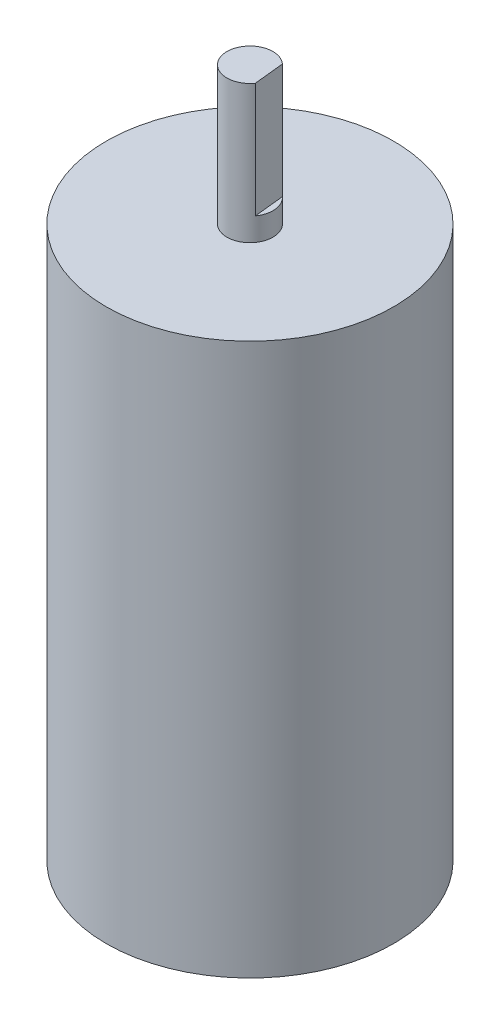
ISO-10303-21;
HEADER;
FILE_DESCRIPTION(('STEP AP214'),'2;1');
FILE_NAME('part.step','',(''),(''),'','','');
FILE_SCHEMA(('AUTOMOTIVE_DESIGN { 1 0 10303 214 1 1 1 1 }'));
ENDSEC;
DATA;
#1=APPLICATION_CONTEXT('core data for automotive mechanical design processes');
#2=APPLICATION_PROTOCOL_DEFINITION('international standard','automotive_design',2000,#1);
#3=PRODUCT_CONTEXT('',#1,'mechanical');
#4=PRODUCT('Part','Part','',(#3));
#5=PRODUCT_RELATED_PRODUCT_CATEGORY('part','',(#4));
#6=PRODUCT_DEFINITION_FORMATION('','',#4);
#7=PRODUCT_DEFINITION_CONTEXT('part definition',#1,'design');
#8=PRODUCT_DEFINITION('design','',#6,#7);
#9=PRODUCT_DEFINITION_SHAPE('','',#8);
#10=(LENGTH_UNIT() NAMED_UNIT(*) SI_UNIT(.MILLI.,.METRE.));
#11=(NAMED_UNIT(*) PLANE_ANGLE_UNIT() SI_UNIT($,.RADIAN.));
#12=(NAMED_UNIT(*) SI_UNIT($,.STERADIAN.) SOLID_ANGLE_UNIT());
#13=UNCERTAINTY_MEASURE_WITH_UNIT(LENGTH_MEASURE(1.E-05),#10,'distance_accuracy_value','');
#14=(GEOMETRIC_REPRESENTATION_CONTEXT(3) GLOBAL_UNCERTAINTY_ASSIGNED_CONTEXT((#13)) GLOBAL_UNIT_ASSIGNED_CONTEXT((#10,
#11,#12)) REPRESENTATION_CONTEXT('',''));
#15=CARTESIAN_POINT('',(0.,0.,0.));
#16=DIRECTION('',(0.,0.,1.));
#17=DIRECTION('',(1.,0.,0.));
#18=AXIS2_PLACEMENT_3D('',#15,#16,#17);
#19=CARTESIAN_POINT('',(0.,48.,0.));
#20=DIRECTION('',(0.,-1.,0.));
#21=DIRECTION('',(0.,0.,-1.));
#22=AXIS2_PLACEMENT_3D('',#19,#20,#21);
#23=CYLINDRICAL_SURFACE('',#22,12.5);
#24=CARTESIAN_POINT('',(0.,48.,0.));
#25=DIRECTION('',(0.,1.,0.));
#26=DIRECTION('',(0.,0.,1.));
#27=AXIS2_PLACEMENT_3D('',#24,#25,#26);
#28=CIRCLE('',#27,12.5);
#29=CARTESIAN_POINT('',(0.,48.,12.5));
#30=VERTEX_POINT('',#29);
#31=EDGE_CURVE('E44',#30,#30,#28,.T.);
#32=ORIENTED_EDGE('',*,*,#31,.F.);
#33=EDGE_LOOP('',(#32));
#34=FACE_BOUND('',#33,.T.);
#35=CARTESIAN_POINT('',(0.,0.,0.));
#36=DIRECTION('',(0.,1.,0.));
#37=DIRECTION('',(0.,0.,1.));
#38=AXIS2_PLACEMENT_3D('',#35,#36,#37);
#39=CIRCLE('',#38,12.5);
#40=CARTESIAN_POINT('',(0.,0.,12.5));
#41=VERTEX_POINT('',#40);
#42=EDGE_CURVE('E39',#41,#41,#39,.T.);
#43=ORIENTED_EDGE('',*,*,#42,.T.);
#44=EDGE_LOOP('',(#43));
#45=FACE_BOUND('',#44,.T.);
#46=ADVANCED_FACE('F36',(#34,#45),#23,.T.);
#47=CARTESIAN_POINT('',(0.,48.,0.));
#48=DIRECTION('',(0.,1.,0.));
#49=DIRECTION('',(0.,0.,1.));
#50=AXIS2_PLACEMENT_3D('',#47,#48,#49);
#51=PLANE('',#50);
#52=CARTESIAN_POINT('',(0.,48.,0.));
#53=DIRECTION('',(0.,1.,0.));
#54=DIRECTION('',(0.,0.,1.));
#55=AXIS2_PLACEMENT_3D('',#52,#53,#54);
#56=CIRCLE('',#55,2.);
#57=CARTESIAN_POINT('',(0.,48.,2.));
#58=VERTEX_POINT('',#57);
#59=EDGE_CURVE('E11',#58,#58,#56,.T.);
#60=ORIENTED_EDGE('',*,*,#59,.F.);
#61=EDGE_LOOP('',(#60));
#62=FACE_BOUND('',#61,.T.);
#63=ORIENTED_EDGE('',*,*,#31,.T.);
#64=EDGE_LOOP('',(#63));
#65=FACE_BOUND('',#64,.T.);
#66=ADVANCED_FACE('F83',(#62,#65),#51,.T.);
#67=CARTESIAN_POINT('',(0.,0.,0.));
#68=DIRECTION('',(0.,1.,0.));
#69=DIRECTION('',(0.,0.,1.));
#70=AXIS2_PLACEMENT_3D('',#67,#68,#69);
#71=PLANE('',#70);
#72=ORIENTED_EDGE('',*,*,#42,.F.);
#73=EDGE_LOOP('',(#72));
#74=FACE_BOUND('',#73,.T.);
#75=ADVANCED_FACE('F89',(#74),#71,.F.);
#76=CARTESIAN_POINT('',(0.,60.,0.));
#77=DIRECTION('',(0.,-1.,0.));
#78=DIRECTION('',(0.,0.,-1.));
#79=AXIS2_PLACEMENT_3D('',#76,#77,#78);
#80=CYLINDRICAL_SURFACE('',#79,2.);
#81=CARTESIAN_POINT('',(0.,60.,0.));
#82=DIRECTION('',(0.,1.,0.));
#83=DIRECTION('',(0.,0.,1.));
#84=AXIS2_PLACEMENT_3D('',#81,#82,#83);
#85=CIRCLE('',#84,2.);
#86=CARTESIAN_POINT('',(1.35486964670431,60.,-1.47116560605506));
#87=VERTEX_POINT('',#86);
#88=CARTESIAN_POINT('',(1.62898557996803,60.,1.16034735327669));
#89=VERTEX_POINT('',#88);
#90=EDGE_CURVE('E74',#87,#89,#85,.T.);
#91=ORIENTED_EDGE('',*,*,#90,.F.);
#92=DIRECTION('',(0.,1.,0.));
#93=VECTOR('',#92,1.);
#94=CARTESIAN_POINT('',(1.35486964670431,50.,-1.47116560605506));
#95=LINE('',#94,#93);
#96=CARTESIAN_POINT('',(1.35486964670431,50.,-1.47116560605506));
#97=VERTEX_POINT('',#96);
#98=EDGE_CURVE('E52',#97,#87,#95,.T.);
#99=ORIENTED_EDGE('',*,*,#98,.F.);
#100=CARTESIAN_POINT('',(0.,50.,0.));
#101=DIRECTION('',(0.,1.,0.));
#102=DIRECTION('',(0.,0.,1.));
#103=AXIS2_PLACEMENT_3D('',#100,#101,#102);
#104=CIRCLE('',#103,2.);
#105=CARTESIAN_POINT('',(1.62898557996803,50.,1.16034735327669));
#106=VERTEX_POINT('',#105);
#107=EDGE_CURVE('E68',#106,#97,#104,.T.);
#108=ORIENTED_EDGE('',*,*,#107,.F.);
#109=DIRECTION('',(0.,1.,0.));
#110=VECTOR('',#109,1.);
#111=CARTESIAN_POINT('',(1.62898557996803,50.,1.16034735327669));
#112=LINE('',#111,#110);
#113=EDGE_CURVE('E58',#106,#89,#112,.T.);
#114=ORIENTED_EDGE('',*,*,#113,.T.);
#115=EDGE_LOOP('',(#91,#99,#108,#114));
#116=FACE_BOUND('',#115,.T.);
#117=ORIENTED_EDGE('',*,*,#59,.T.);
#118=EDGE_LOOP('',(#117));
#119=FACE_BOUND('',#118,.T.);
#120=ADVANCED_FACE('F72',(#116,#119),#80,.T.);
#121=CARTESIAN_POINT('',(0.,60.,0.));
#122=DIRECTION('',(0.,1.,0.));
#123=DIRECTION('',(0.,0.,1.));
#124=AXIS2_PLACEMENT_3D('',#121,#122,#123);
#125=PLANE('',#124);
#126=DIRECTION('',(0.103606084259456,0.,0.994618408890778));
#127=VECTOR('',#126,1.);
#128=CARTESIAN_POINT('',(1.62898557996803,60.,1.16034735327669));
#129=LINE('',#128,#127);
#130=EDGE_CURVE('E63',#87,#89,#129,.T.);
#131=ORIENTED_EDGE('',*,*,#130,.F.);
#132=ORIENTED_EDGE('',*,*,#90,.T.);
#133=EDGE_LOOP('',(#131,#132));
#134=FACE_BOUND('',#133,.T.);
#135=ADVANCED_FACE('F76',(#134),#125,.T.);
#136=CARTESIAN_POINT('',(1.62898557996803,50.,1.16034735327669));
#137=DIRECTION('',(-0.994618408890778,0.,0.103606084259456));
#138=DIRECTION('',(0.103606084259456,0.,0.994618408890778));
#139=AXIS2_PLACEMENT_3D('',#136,#137,#138);
#140=PLANE('',#139);
#141=ORIENTED_EDGE('',*,*,#130,.T.);
#142=ORIENTED_EDGE('',*,*,#113,.F.);
#143=DIRECTION('',(0.103606084259456,0.,0.994618408890778));
#144=VECTOR('',#143,1.);
#145=CARTESIAN_POINT('',(1.62898557996803,50.,1.16034735327669));
#146=LINE('',#145,#144);
#147=EDGE_CURVE('E108',#97,#106,#146,.T.);
#148=ORIENTED_EDGE('',*,*,#147,.F.);
#149=ORIENTED_EDGE('',*,*,#98,.T.);
#150=EDGE_LOOP('',(#141,#142,#148,#149));
#151=FACE_BOUND('',#150,.T.);
#152=ADVANCED_FACE('F64',(#151),#140,.F.);
#153=CARTESIAN_POINT('',(0.,50.,0.));
#154=DIRECTION('',(0.,1.,0.));
#155=DIRECTION('',(0.,0.,1.));
#156=AXIS2_PLACEMENT_3D('',#153,#154,#155);
#157=PLANE('',#156);
#158=ORIENTED_EDGE('',*,*,#107,.T.);
#159=ORIENTED_EDGE('',*,*,#147,.T.);
#160=EDGE_LOOP('',(#158,#159));
#161=FACE_BOUND('',#160,.T.);
#162=ADVANCED_FACE('F103',(#161),#157,.T.);
#163=CLOSED_SHELL('',(#46,#66,#75,#120,#135,#152,#162));
#164=MANIFOLD_SOLID_BREP('B2',#163);
#165=ADVANCED_BREP_SHAPE_REPRESENTATION('',(#18,#164),#14);
#166=SHAPE_DEFINITION_REPRESENTATION(#9,#165);
ENDSEC;
END-ISO-10303-21;
